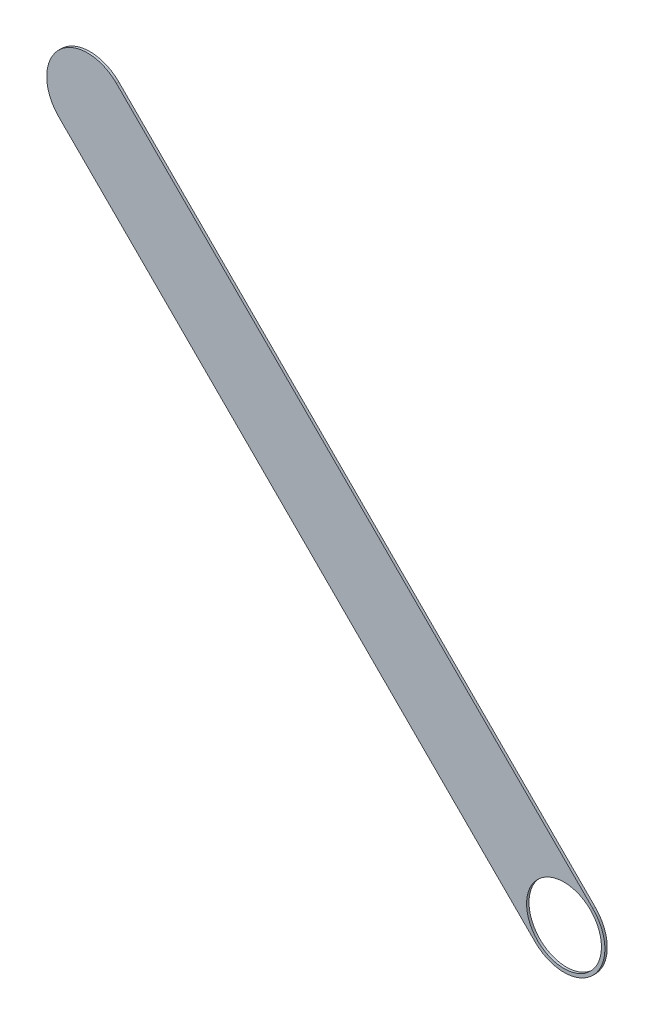
ISO-10303-21;
HEADER;
FILE_DESCRIPTION(('STEP AP214'),'2;1');
FILE_NAME('part.step','',(''),(''),'','','');
FILE_SCHEMA(('AUTOMOTIVE_DESIGN { 1 0 10303 214 1 1 1 1 }'));
ENDSEC;
DATA;
#1=APPLICATION_CONTEXT('core data for automotive mechanical design processes');
#2=APPLICATION_PROTOCOL_DEFINITION('international standard','automotive_design',2000,#1);
#3=PRODUCT_CONTEXT('',#1,'mechanical');
#4=PRODUCT('Part','Part','',(#3));
#5=PRODUCT_RELATED_PRODUCT_CATEGORY('part','',(#4));
#6=PRODUCT_DEFINITION_FORMATION('','',#4);
#7=PRODUCT_DEFINITION_CONTEXT('part definition',#1,'design');
#8=PRODUCT_DEFINITION('design','',#6,#7);
#9=PRODUCT_DEFINITION_SHAPE('','',#8);
#10=(LENGTH_UNIT() NAMED_UNIT(*) SI_UNIT(.MILLI.,.METRE.));
#11=(NAMED_UNIT(*) PLANE_ANGLE_UNIT() SI_UNIT($,.RADIAN.));
#12=(NAMED_UNIT(*) SI_UNIT($,.STERADIAN.) SOLID_ANGLE_UNIT());
#13=UNCERTAINTY_MEASURE_WITH_UNIT(LENGTH_MEASURE(1.E-05),#10,'distance_accuracy_value','');
#14=(GEOMETRIC_REPRESENTATION_CONTEXT(3) GLOBAL_UNCERTAINTY_ASSIGNED_CONTEXT((#13)) GLOBAL_UNIT_ASSIGNED_CONTEXT((#10,
#11,#12)) REPRESENTATION_CONTEXT('',''));
#15=CARTESIAN_POINT('',(0.,0.,0.));
#16=DIRECTION('',(0.,0.,1.));
#17=DIRECTION('',(1.,0.,0.));
#18=AXIS2_PLACEMENT_3D('',#15,#16,#17);
#19=CARTESIAN_POINT('',(71.47573716,77.15580454,0.));
#20=DIRECTION('',(0.707106781186547,0.707106781186548,0.));
#21=DIRECTION('',(0.707106781186548,-0.707106781186547,0.));
#22=AXIS2_PLACEMENT_3D('',#19,#20,#21);
#23=PLANE('',#22);
#24=DIRECTION('',(0.707106781186548,-0.707106781186547,0.));
#25=VECTOR('',#24,1.);
#26=CARTESIAN_POINT('',(71.47573716,77.15580454,0.03556));
#27=LINE('',#26,#25);
#28=CARTESIAN_POINT('',(71.47573716,77.15580454,0.03556));
#29=VERTEX_POINT('',#28);
#30=CARTESIAN_POINT('',(78.47575872,70.15578298,0.03556));
#31=VERTEX_POINT('',#30);
#32=EDGE_CURVE('E11',#29,#31,#27,.T.);
#33=ORIENTED_EDGE('',*,*,#32,.F.);
#34=DIRECTION('',(0.,0.,1.));
#35=VECTOR('',#34,1.);
#36=CARTESIAN_POINT('',(71.47573716,77.15580454,0.));
#37=LINE('',#36,#35);
#38=CARTESIAN_POINT('',(71.47573716,77.15580454,0.));
#39=VERTEX_POINT('',#38);
#40=EDGE_CURVE('E24',#39,#29,#37,.T.);
#41=ORIENTED_EDGE('',*,*,#40,.F.);
#42=DIRECTION('',(0.707106781186548,-0.707106781186547,0.));
#43=VECTOR('',#42,1.);
#44=CARTESIAN_POINT('',(71.47573716,77.15580454,0.));
#45=LINE('',#44,#43);
#46=CARTESIAN_POINT('',(78.47575872,70.15578298,0.));
#47=VERTEX_POINT('',#46);
#48=EDGE_CURVE('E96',#39,#47,#45,.T.);
#49=ORIENTED_EDGE('',*,*,#48,.T.);
#50=DIRECTION('',(0.,0.,1.));
#51=VECTOR('',#50,1.);
#52=CARTESIAN_POINT('',(78.47575872,70.15578298,0.));
#53=LINE('',#52,#51);
#54=EDGE_CURVE('E37',#47,#31,#53,.T.);
#55=ORIENTED_EDGE('',*,*,#54,.T.);
#56=EDGE_LOOP('',(#33,#41,#49,#55));
#57=FACE_BOUND('',#56,.T.);
#58=ADVANCED_FACE('F17',(#57),#23,.F.);
#59=CARTESIAN_POINT('',(71.90000098,77.58006709,0.));
#60=DIRECTION('',(0.,0.,-1.));
#61=DIRECTION('',(0.707107839521304,0.707105722850207,0.));
#62=AXIS2_PLACEMENT_3D('',#59,#60,#61);
#63=CYLINDRICAL_SURFACE('',#62,0.599998750243275);
#64=CARTESIAN_POINT('',(71.90000098,77.58006709,0.03556));
#65=DIRECTION('',(0.,0.,1.));
#66=DIRECTION('',(0.707107839521304,0.707105722850207,0.));
#67=AXIS2_PLACEMENT_3D('',#64,#65,#66);
#68=CIRCLE('',#67,0.599998750243275);
#69=CARTESIAN_POINT('',(72.3242648,78.00432964,0.03556));
#70=VERTEX_POINT('',#69);
#71=EDGE_CURVE('E92',#70,#29,#68,.T.);
#72=ORIENTED_EDGE('',*,*,#71,.F.);
#73=DIRECTION('',(0.,0.,1.));
#74=VECTOR('',#73,1.);
#75=CARTESIAN_POINT('',(72.3242648,78.00432964,0.));
#76=LINE('',#75,#74);
#77=CARTESIAN_POINT('',(72.3242648,78.00432964,0.));
#78=VERTEX_POINT('',#77);
#79=EDGE_CURVE('E90',#78,#70,#76,.T.);
#80=ORIENTED_EDGE('',*,*,#79,.F.);
#81=CARTESIAN_POINT('',(71.90000098,77.58006709,0.));
#82=DIRECTION('',(0.,0.,1.));
#83=DIRECTION('',(0.707107839521304,0.707105722850207,0.));
#84=AXIS2_PLACEMENT_3D('',#81,#82,#83);
#85=CIRCLE('',#84,0.599998750243275);
#86=EDGE_CURVE('E88',#78,#39,#85,.T.);
#87=ORIENTED_EDGE('',*,*,#86,.T.);
#88=ORIENTED_EDGE('',*,*,#40,.T.);
#89=EDGE_LOOP('',(#72,#80,#87,#88));
#90=FACE_BOUND('',#89,.T.);
#91=ADVANCED_FACE('F111',(#90),#63,.T.);
#92=CARTESIAN_POINT('',(78.90002127,70.5800468,0.));
#93=DIRECTION('',(0.,0.,-1.));
#94=DIRECTION('',(-0.707105722850219,-0.707107839521292,0.));
#95=AXIS2_PLACEMENT_3D('',#92,#93,#94);
#96=CYLINDRICAL_SURFACE('',#95,0.599998750243279);
#97=CARTESIAN_POINT('',(78.90002127,70.5800468,0.03556));
#98=DIRECTION('',(0.,0.,1.));
#99=DIRECTION('',(-0.707105722850219,-0.707107839521292,0.));
#100=AXIS2_PLACEMENT_3D('',#97,#98,#99);
#101=CIRCLE('',#100,0.599998750243279);
#102=CARTESIAN_POINT('',(79.32428382,71.00431062,0.03556));
#103=VERTEX_POINT('',#102);
#104=EDGE_CURVE('E85',#31,#103,#101,.T.);
#105=ORIENTED_EDGE('',*,*,#104,.F.);
#106=ORIENTED_EDGE('',*,*,#54,.F.);
#107=CARTESIAN_POINT('',(78.90002127,70.5800468,0.));
#108=DIRECTION('',(0.,0.,1.));
#109=DIRECTION('',(-0.707105722850219,-0.707107839521292,0.));
#110=AXIS2_PLACEMENT_3D('',#107,#108,#109);
#111=CIRCLE('',#110,0.599998750243279);
#112=CARTESIAN_POINT('',(79.32428382,71.00431062,0.));
#113=VERTEX_POINT('',#112);
#114=EDGE_CURVE('E82',#47,#113,#111,.T.);
#115=ORIENTED_EDGE('',*,*,#114,.T.);
#116=DIRECTION('',(0.,0.,1.));
#117=VECTOR('',#116,1.);
#118=CARTESIAN_POINT('',(79.32428382,71.00431062,0.));
#119=LINE('',#118,#117);
#120=EDGE_CURVE('E80',#113,#103,#119,.T.);
#121=ORIENTED_EDGE('',*,*,#120,.T.);
#122=EDGE_LOOP('',(#105,#106,#115,#121));
#123=FACE_BOUND('',#122,.T.);
#124=ADVANCED_FACE('F104',(#123),#96,.T.);
#125=CARTESIAN_POINT('',(79.32428382,71.00431062,0.));
#126=DIRECTION('',(-0.707106781186547,-0.707106781186548,0.));
#127=DIRECTION('',(-0.707106781186548,0.707106781186547,0.));
#128=AXIS2_PLACEMENT_3D('',#125,#126,#127);
#129=PLANE('',#128);
#130=DIRECTION('',(-0.707106781186548,0.707106781186547,0.));
#131=VECTOR('',#130,1.);
#132=CARTESIAN_POINT('',(79.32428382,71.00431062,0.03556));
#133=LINE('',#132,#131);
#134=EDGE_CURVE('E77',#103,#70,#133,.T.);
#135=ORIENTED_EDGE('',*,*,#134,.F.);
#136=ORIENTED_EDGE('',*,*,#120,.F.);
#137=DIRECTION('',(-0.707106781186548,0.707106781186547,0.));
#138=VECTOR('',#137,1.);
#139=CARTESIAN_POINT('',(79.32428382,71.00431062,0.));
#140=LINE('',#139,#138);
#141=EDGE_CURVE('E68',#113,#78,#140,.T.);
#142=ORIENTED_EDGE('',*,*,#141,.T.);
#143=ORIENTED_EDGE('',*,*,#79,.T.);
#144=EDGE_LOOP('',(#135,#136,#142,#143));
#145=FACE_BOUND('',#144,.T.);
#146=ADVANCED_FACE('F110',(#145),#129,.F.);
#147=CARTESIAN_POINT('',(78.90002,70.5800468,0.));
#148=DIRECTION('',(0.,0.,-1.));
#149=DIRECTION('',(1.,0.,0.));
#150=AXIS2_PLACEMENT_3D('',#147,#148,#149);
#151=CYLINDRICAL_SURFACE('',#150,0.5499989);
#152=DIRECTION('',(0.,0.,1.));
#153=VECTOR('',#152,1.);
#154=CARTESIAN_POINT('',(79.4500189,70.5800468,0.));
#155=LINE('',#154,#153);
#156=CARTESIAN_POINT('',(79.4500189,70.5800468,0.));
#157=VERTEX_POINT('',#156);
#158=CARTESIAN_POINT('',(79.4500189,70.5800468,0.03556));
#159=VERTEX_POINT('',#158);
#160=EDGE_CURVE('E62',#157,#159,#155,.T.);
#161=ORIENTED_EDGE('',*,*,#160,.T.);
#162=CARTESIAN_POINT('',(78.90002,70.5800468,0.03556));
#163=DIRECTION('',(0.,0.,1.));
#164=DIRECTION('',(1.,0.,0.));
#165=AXIS2_PLACEMENT_3D('',#162,#163,#164);
#166=CIRCLE('',#165,0.5499989);
#167=EDGE_CURVE('E67',#159,#159,#166,.T.);
#168=ORIENTED_EDGE('',*,*,#167,.T.);
#169=ORIENTED_EDGE('',*,*,#160,.F.);
#170=CARTESIAN_POINT('',(78.90002,70.5800468,0.));
#171=DIRECTION('',(0.,0.,1.));
#172=DIRECTION('',(1.,0.,0.));
#173=AXIS2_PLACEMENT_3D('',#170,#171,#172);
#174=CIRCLE('',#173,0.5499989);
#175=EDGE_CURVE('E65',#157,#157,#174,.T.);
#176=ORIENTED_EDGE('',*,*,#175,.F.);
#177=EDGE_LOOP('',(#161,#168,#169,#176));
#178=FACE_BOUND('',#177,.T.);
#179=ADVANCED_FACE('F64',(#178),#151,.F.);
#180=CARTESIAN_POINT('',(71.47573716,77.15580454,0.));
#181=DIRECTION('',(0.,0.,-1.));
#182=DIRECTION('',(-1.,0.,0.));
#183=AXIS2_PLACEMENT_3D('',#180,#181,#182);
#184=PLANE('',#183);
#185=ORIENTED_EDGE('',*,*,#48,.F.);
#186=ORIENTED_EDGE('',*,*,#86,.F.);
#187=ORIENTED_EDGE('',*,*,#141,.F.);
#188=ORIENTED_EDGE('',*,*,#114,.F.);
#189=EDGE_LOOP('',(#185,#186,#187,#188));
#190=FACE_BOUND('',#189,.T.);
#191=ORIENTED_EDGE('',*,*,#175,.T.);
#192=EDGE_LOOP('',(#191));
#193=FACE_BOUND('',#192,.T.);
#194=ADVANCED_FACE('F71',(#190,#193),#184,.T.);
#195=CARTESIAN_POINT('',(71.47573716,77.15580454,0.03556));
#196=DIRECTION('',(0.,0.,-1.));
#197=DIRECTION('',(-1.,0.,0.));
#198=AXIS2_PLACEMENT_3D('',#195,#196,#197);
#199=PLANE('',#198);
#200=ORIENTED_EDGE('',*,*,#134,.T.);
#201=ORIENTED_EDGE('',*,*,#71,.T.);
#202=ORIENTED_EDGE('',*,*,#32,.T.);
#203=ORIENTED_EDGE('',*,*,#104,.T.);
#204=EDGE_LOOP('',(#200,#201,#202,#203));
#205=FACE_BOUND('',#204,.T.);
#206=ORIENTED_EDGE('',*,*,#167,.F.);
#207=EDGE_LOOP('',(#206));
#208=FACE_BOUND('',#207,.T.);
#209=ADVANCED_FACE('F107',(#205,#208),#199,.F.);
#210=CLOSED_SHELL('',(#58,#91,#124,#146,#179,#194,#209));
#211=MANIFOLD_SOLID_BREP('B1',#210);
#212=ADVANCED_BREP_SHAPE_REPRESENTATION('',(#18,#211),#14);
#213=SHAPE_DEFINITION_REPRESENTATION(#9,#212);
ENDSEC;
END-ISO-10303-21;
